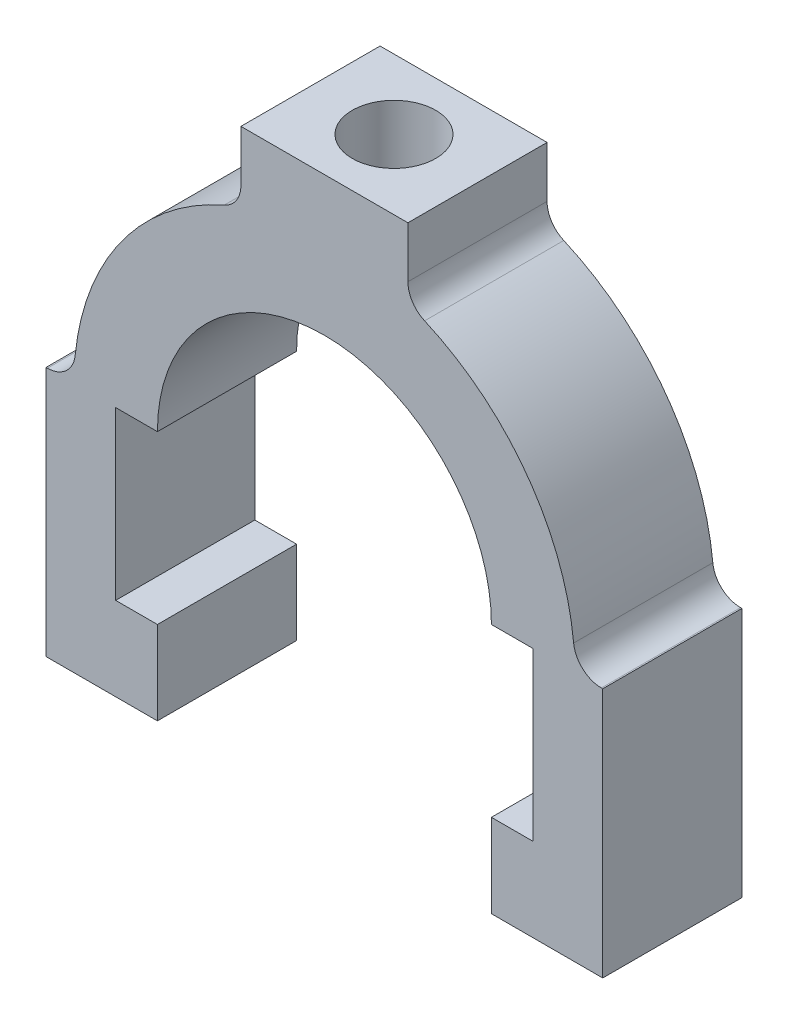
ISO-10303-21;
HEADER;
FILE_DESCRIPTION(('STEP AP214'),'2;1');
FILE_NAME('part.step','',(''),(''),'','','');
FILE_SCHEMA(('AUTOMOTIVE_DESIGN { 1 0 10303 214 1 1 1 1 }'));
ENDSEC;
DATA;
#1=APPLICATION_CONTEXT('core data for automotive mechanical design processes');
#2=APPLICATION_PROTOCOL_DEFINITION('international standard','automotive_design',2000,#1);
#3=PRODUCT_CONTEXT('',#1,'mechanical');
#4=PRODUCT('Part','Part','',(#3));
#5=PRODUCT_RELATED_PRODUCT_CATEGORY('part','',(#4));
#6=PRODUCT_DEFINITION_FORMATION('','',#4);
#7=PRODUCT_DEFINITION_CONTEXT('part definition',#1,'design');
#8=PRODUCT_DEFINITION('design','',#6,#7);
#9=PRODUCT_DEFINITION_SHAPE('','',#8);
#10=(LENGTH_UNIT() NAMED_UNIT(*) SI_UNIT(.MILLI.,.METRE.));
#11=(NAMED_UNIT(*) PLANE_ANGLE_UNIT() SI_UNIT($,.RADIAN.));
#12=(NAMED_UNIT(*) SI_UNIT($,.STERADIAN.) SOLID_ANGLE_UNIT());
#13=UNCERTAINTY_MEASURE_WITH_UNIT(LENGTH_MEASURE(1.E-05),#10,'distance_accuracy_value','');
#14=(GEOMETRIC_REPRESENTATION_CONTEXT(3) GLOBAL_UNCERTAINTY_ASSIGNED_CONTEXT((#13)) GLOBAL_UNIT_ASSIGNED_CONTEXT((#10,
#11,#12)) REPRESENTATION_CONTEXT('',''));
#15=CARTESIAN_POINT('',(0.,0.,0.));
#16=DIRECTION('',(0.,0.,1.));
#17=DIRECTION('',(1.,0.,0.));
#18=AXIS2_PLACEMENT_3D('',#15,#16,#17);
#19=CARTESIAN_POINT('',(-16.,36.6606055596467,20.));
#20=DIRECTION('',(0.,0.,-1.));
#21=DIRECTION('',(-1.,0.,0.));
#22=AXIS2_PLACEMENT_3D('',#19,#20,#21);
#23=CYLINDRICAL_SURFACE('',#22,4.);
#24=CARTESIAN_POINT('',(-16.,36.6606055596467,0.));
#25=DIRECTION('',(0.,0.,-1.));
#26=DIRECTION('',(1.,0.,0.));
#27=AXIS2_PLACEMENT_3D('',#24,#25,#26);
#28=CIRCLE('',#27,4.);
#29=CARTESIAN_POINT('',(-12.,36.6606055596467,0.));
#30=VERTEX_POINT('',#29);
#31=CARTESIAN_POINT('',(-14.4,32.994545003682,0.));
#32=VERTEX_POINT('',#31);
#33=EDGE_CURVE('E258',#30,#32,#28,.T.);
#34=ORIENTED_EDGE('',*,*,#33,.T.);
#35=DIRECTION('',(0.,0.,-1.));
#36=VECTOR('',#35,1.);
#37=CARTESIAN_POINT('',(-14.4,32.994545003682,20.));
#38=LINE('',#37,#36);
#39=CARTESIAN_POINT('',(-14.4,32.994545003682,20.));
#40=VERTEX_POINT('',#39);
#41=EDGE_CURVE('E13',#40,#32,#38,.T.);
#42=ORIENTED_EDGE('',*,*,#41,.F.);
#43=CARTESIAN_POINT('',(-16.,36.6606055596467,20.));
#44=DIRECTION('',(0.,0.,-1.));
#45=DIRECTION('',(1.,0.,0.));
#46=AXIS2_PLACEMENT_3D('',#43,#44,#45);
#47=CIRCLE('',#46,4.);
#48=CARTESIAN_POINT('',(-12.,36.6606055596467,20.));
#49=VERTEX_POINT('',#48);
#50=EDGE_CURVE('E329',#49,#40,#47,.T.);
#51=ORIENTED_EDGE('',*,*,#50,.F.);
#52=DIRECTION('',(0.,0.,-1.));
#53=VECTOR('',#52,1.);
#54=CARTESIAN_POINT('',(-12.,36.6606055596467,20.));
#55=LINE('',#54,#53);
#56=EDGE_CURVE('E254',#49,#30,#55,.T.);
#57=ORIENTED_EDGE('',*,*,#56,.T.);
#58=EDGE_LOOP('',(#34,#42,#51,#57));
#59=FACE_BOUND('',#58,.T.);
#60=ADVANCED_FACE('F59',(#59),#23,.F.);
#61=CARTESIAN_POINT('',(0.,0.,20.));
#62=DIRECTION('',(0.,0.,-1.));
#63=DIRECTION('',(-1.,0.,0.));
#64=AXIS2_PLACEMENT_3D('',#61,#62,#63);
#65=CYLINDRICAL_SURFACE('',#64,36.);
#66=CARTESIAN_POINT('',(0.,0.,0.));
#67=DIRECTION('',(0.,0.,1.));
#68=DIRECTION('',(1.,0.,0.));
#69=AXIS2_PLACEMENT_3D('',#66,#67,#68);
#70=CIRCLE('',#69,36.);
#71=CARTESIAN_POINT('',(-35.8195477358383,3.59999999999999,0.));
#72=VERTEX_POINT('',#71);
#73=EDGE_CURVE('E262',#32,#72,#70,.T.);
#74=ORIENTED_EDGE('',*,*,#73,.T.);
#75=DIRECTION('',(0.,0.,-1.));
#76=VECTOR('',#75,1.);
#77=CARTESIAN_POINT('',(-35.8195477358383,3.59999999999999,20.));
#78=LINE('',#77,#76);
#79=CARTESIAN_POINT('',(-35.8195477358383,3.59999999999999,20.));
#80=VERTEX_POINT('',#79);
#81=EDGE_CURVE('E68',#80,#72,#78,.T.);
#82=ORIENTED_EDGE('',*,*,#81,.F.);
#83=CARTESIAN_POINT('',(0.,0.,20.));
#84=DIRECTION('',(0.,0.,1.));
#85=DIRECTION('',(1.,0.,0.));
#86=AXIS2_PLACEMENT_3D('',#83,#84,#85);
#87=CIRCLE('',#86,36.);
#88=EDGE_CURVE('E167',#40,#80,#87,.T.);
#89=ORIENTED_EDGE('',*,*,#88,.F.);
#90=ORIENTED_EDGE('',*,*,#41,.T.);
#91=EDGE_LOOP('',(#74,#82,#89,#90));
#92=FACE_BOUND('',#91,.T.);
#93=ADVANCED_FACE('F665',(#92),#65,.T.);
#94=CARTESIAN_POINT('',(-39.7994974842648,3.99999999999999,20.));
#95=DIRECTION('',(0.,0.,-1.));
#96=DIRECTION('',(-1.,0.,0.));
#97=AXIS2_PLACEMENT_3D('',#94,#95,#96);
#98=CYLINDRICAL_SURFACE('',#97,4.);
#99=CARTESIAN_POINT('',(-39.7994974842648,3.99999999999999,0.));
#100=DIRECTION('',(0.,0.,-1.));
#101=DIRECTION('',(1.,0.,0.));
#102=AXIS2_PLACEMENT_3D('',#99,#100,#101);
#103=CIRCLE('',#102,4.);
#104=CARTESIAN_POINT('',(-39.7994974842648,0.,0.));
#105=VERTEX_POINT('',#104);
#106=EDGE_CURVE('E266',#72,#105,#103,.T.);
#107=ORIENTED_EDGE('',*,*,#106,.T.);
#108=DIRECTION('',(0.,0.,-1.));
#109=VECTOR('',#108,1.);
#110=CARTESIAN_POINT('',(-39.7994974842648,0.,20.));
#111=LINE('',#110,#109);
#112=CARTESIAN_POINT('',(-39.7994974842648,0.,20.));
#113=VERTEX_POINT('',#112);
#114=EDGE_CURVE('E404',#113,#105,#111,.T.);
#115=ORIENTED_EDGE('',*,*,#114,.F.);
#116=CARTESIAN_POINT('',(-39.7994974842648,3.99999999999999,20.));
#117=DIRECTION('',(0.,0.,-1.));
#118=DIRECTION('',(1.,0.,0.));
#119=AXIS2_PLACEMENT_3D('',#116,#117,#118);
#120=CIRCLE('',#119,4.);
#121=EDGE_CURVE('E416',#80,#113,#120,.T.);
#122=ORIENTED_EDGE('',*,*,#121,.F.);
#123=ORIENTED_EDGE('',*,*,#81,.T.);
#124=EDGE_LOOP('',(#107,#115,#122,#123));
#125=FACE_BOUND('',#124,.T.);
#126=ADVANCED_FACE('F414',(#125),#98,.F.);
#127=CARTESIAN_POINT('',(-40.,0.,20.));
#128=DIRECTION('',(0.,-1.,0.));
#129=DIRECTION('',(1.,0.,0.));
#130=AXIS2_PLACEMENT_3D('',#127,#128,#129);
#131=PLANE('',#130);
#132=DIRECTION('',(-1.,0.,0.));
#133=VECTOR('',#132,1.);
#134=CARTESIAN_POINT('',(-40.,0.,0.));
#135=LINE('',#134,#133);
#136=CARTESIAN_POINT('',(-40.,0.,0.));
#137=VERTEX_POINT('',#136);
#138=EDGE_CURVE('E269',#105,#137,#135,.T.);
#139=ORIENTED_EDGE('',*,*,#138,.T.);
#140=DIRECTION('',(0.,0.,-1.));
#141=VECTOR('',#140,1.);
#142=CARTESIAN_POINT('',(-40.,0.,20.));
#143=LINE('',#142,#141);
#144=CARTESIAN_POINT('',(-40.,0.,20.));
#145=VERTEX_POINT('',#144);
#146=EDGE_CURVE('E400',#145,#137,#143,.T.);
#147=ORIENTED_EDGE('',*,*,#146,.F.);
#148=DIRECTION('',(-1.,0.,0.));
#149=VECTOR('',#148,1.);
#150=CARTESIAN_POINT('',(-40.,0.,20.));
#151=LINE('',#150,#149);
#152=EDGE_CURVE('E435',#113,#145,#151,.T.);
#153=ORIENTED_EDGE('',*,*,#152,.F.);
#154=ORIENTED_EDGE('',*,*,#114,.T.);
#155=EDGE_LOOP('',(#139,#147,#153,#154));
#156=FACE_BOUND('',#155,.T.);
#157=ADVANCED_FACE('F425',(#156),#131,.F.);
#158=CARTESIAN_POINT('',(-40.,-36.,20.));
#159=DIRECTION('',(1.,0.,0.));
#160=DIRECTION('',(0.,1.,0.));
#161=AXIS2_PLACEMENT_3D('',#158,#159,#160);
#162=PLANE('',#161);
#163=DIRECTION('',(0.,-1.,0.));
#164=VECTOR('',#163,1.);
#165=CARTESIAN_POINT('',(-40.,-36.,0.));
#166=LINE('',#165,#164);
#167=CARTESIAN_POINT('',(-40.,-36.,0.));
#168=VERTEX_POINT('',#167);
#169=EDGE_CURVE('E272',#137,#168,#166,.T.);
#170=ORIENTED_EDGE('',*,*,#169,.T.);
#171=DIRECTION('',(0.,0.,-1.));
#172=VECTOR('',#171,1.);
#173=CARTESIAN_POINT('',(-40.,-36.,20.));
#174=LINE('',#173,#172);
#175=CARTESIAN_POINT('',(-40.,-36.,20.));
#176=VERTEX_POINT('',#175);
#177=EDGE_CURVE('E396',#176,#168,#174,.T.);
#178=ORIENTED_EDGE('',*,*,#177,.F.);
#179=DIRECTION('',(0.,-1.,0.));
#180=VECTOR('',#179,1.);
#181=CARTESIAN_POINT('',(-40.,-36.,20.));
#182=LINE('',#181,#180);
#183=EDGE_CURVE('E431',#145,#176,#182,.T.);
#184=ORIENTED_EDGE('',*,*,#183,.F.);
#185=ORIENTED_EDGE('',*,*,#146,.T.);
#186=EDGE_LOOP('',(#170,#178,#184,#185));
#187=FACE_BOUND('',#186,.T.);
#188=ADVANCED_FACE('F429',(#187),#162,.F.);
#189=CARTESIAN_POINT('',(-24.,-36.,20.));
#190=DIRECTION('',(0.,1.,0.));
#191=DIRECTION('',(-1.,0.,0.));
#192=AXIS2_PLACEMENT_3D('',#189,#190,#191);
#193=PLANE('',#192);
#194=DIRECTION('',(1.,0.,0.));
#195=VECTOR('',#194,1.);
#196=CARTESIAN_POINT('',(-24.,-36.,0.));
#197=LINE('',#196,#195);
#198=CARTESIAN_POINT('',(-24.,-36.,0.));
#199=VERTEX_POINT('',#198);
#200=EDGE_CURVE('E275',#168,#199,#197,.T.);
#201=ORIENTED_EDGE('',*,*,#200,.T.);
#202=DIRECTION('',(0.,0.,-1.));
#203=VECTOR('',#202,1.);
#204=CARTESIAN_POINT('',(-24.,-36.,20.));
#205=LINE('',#204,#203);
#206=CARTESIAN_POINT('',(-24.,-36.,20.));
#207=VERTEX_POINT('',#206);
#208=EDGE_CURVE('E392',#207,#199,#205,.T.);
#209=ORIENTED_EDGE('',*,*,#208,.F.);
#210=DIRECTION('',(1.,0.,0.));
#211=VECTOR('',#210,1.);
#212=CARTESIAN_POINT('',(-24.,-36.,20.));
#213=LINE('',#212,#211);
#214=EDGE_CURVE('E434',#176,#207,#213,.T.);
#215=ORIENTED_EDGE('',*,*,#214,.F.);
#216=ORIENTED_EDGE('',*,*,#177,.T.);
#217=EDGE_LOOP('',(#201,#209,#215,#216));
#218=FACE_BOUND('',#217,.T.);
#219=ADVANCED_FACE('F725',(#218),#193,.F.);
#220=CARTESIAN_POINT('',(-24.,-24.,20.));
#221=DIRECTION('',(-1.,0.,0.));
#222=DIRECTION('',(0.,0.,1.));
#223=AXIS2_PLACEMENT_3D('',#220,#221,#222);
#224=PLANE('',#223);
#225=DIRECTION('',(0.,1.,0.));
#226=VECTOR('',#225,1.);
#227=CARTESIAN_POINT('',(-24.,-24.,0.));
#228=LINE('',#227,#226);
#229=CARTESIAN_POINT('',(-24.,-24.,0.));
#230=VERTEX_POINT('',#229);
#231=EDGE_CURVE('E278',#199,#230,#228,.T.);
#232=ORIENTED_EDGE('',*,*,#231,.T.);
#233=DIRECTION('',(0.,0.,-1.));
#234=VECTOR('',#233,1.);
#235=CARTESIAN_POINT('',(-24.,-24.,20.));
#236=LINE('',#235,#234);
#237=CARTESIAN_POINT('',(-24.,-24.,20.));
#238=VERTEX_POINT('',#237);
#239=EDGE_CURVE('E388',#238,#230,#236,.T.);
#240=ORIENTED_EDGE('',*,*,#239,.F.);
#241=DIRECTION('',(0.,1.,0.));
#242=VECTOR('',#241,1.);
#243=CARTESIAN_POINT('',(-24.,-24.,20.));
#244=LINE('',#243,#242);
#245=EDGE_CURVE('E441',#207,#238,#244,.T.);
#246=ORIENTED_EDGE('',*,*,#245,.F.);
#247=ORIENTED_EDGE('',*,*,#208,.T.);
#248=EDGE_LOOP('',(#232,#240,#246,#247));
#249=FACE_BOUND('',#248,.T.);
#250=ADVANCED_FACE('F722',(#249),#224,.F.);
#251=CARTESIAN_POINT('',(-30.,-24.,20.));
#252=DIRECTION('',(0.,-1.,0.));
#253=DIRECTION('',(1.,0.,0.));
#254=AXIS2_PLACEMENT_3D('',#251,#252,#253);
#255=PLANE('',#254);
#256=DIRECTION('',(-1.,0.,0.));
#257=VECTOR('',#256,1.);
#258=CARTESIAN_POINT('',(-30.,-24.,0.));
#259=LINE('',#258,#257);
#260=CARTESIAN_POINT('',(-30.,-24.,0.));
#261=VERTEX_POINT('',#260);
#262=EDGE_CURVE('E281',#230,#261,#259,.T.);
#263=ORIENTED_EDGE('',*,*,#262,.T.);
#264=DIRECTION('',(0.,0.,-1.));
#265=VECTOR('',#264,1.);
#266=CARTESIAN_POINT('',(-30.,-24.,20.));
#267=LINE('',#266,#265);
#268=CARTESIAN_POINT('',(-30.,-24.,20.));
#269=VERTEX_POINT('',#268);
#270=EDGE_CURVE('E384',#269,#261,#267,.T.);
#271=ORIENTED_EDGE('',*,*,#270,.F.);
#272=DIRECTION('',(-1.,0.,0.));
#273=VECTOR('',#272,1.);
#274=CARTESIAN_POINT('',(-30.,-24.,20.));
#275=LINE('',#274,#273);
#276=EDGE_CURVE('E448',#238,#269,#275,.T.);
#277=ORIENTED_EDGE('',*,*,#276,.F.);
#278=ORIENTED_EDGE('',*,*,#239,.T.);
#279=EDGE_LOOP('',(#263,#271,#277,#278));
#280=FACE_BOUND('',#279,.T.);
#281=ADVANCED_FACE('F718',(#280),#255,.F.);
#282=CARTESIAN_POINT('',(-30.,0.,20.));
#283=DIRECTION('',(-1.,0.,0.));
#284=DIRECTION('',(0.,-1.,0.));
#285=AXIS2_PLACEMENT_3D('',#282,#283,#284);
#286=PLANE('',#285);
#287=DIRECTION('',(0.,1.,0.));
#288=VECTOR('',#287,1.);
#289=CARTESIAN_POINT('',(-30.,0.,0.));
#290=LINE('',#289,#288);
#291=CARTESIAN_POINT('',(-30.,0.,0.));
#292=VERTEX_POINT('',#291);
#293=EDGE_CURVE('E284',#261,#292,#290,.T.);
#294=ORIENTED_EDGE('',*,*,#293,.T.);
#295=DIRECTION('',(0.,0.,-1.));
#296=VECTOR('',#295,1.);
#297=CARTESIAN_POINT('',(-30.,0.,20.));
#298=LINE('',#297,#296);
#299=CARTESIAN_POINT('',(-30.,0.,20.));
#300=VERTEX_POINT('',#299);
#301=EDGE_CURVE('E380',#300,#292,#298,.T.);
#302=ORIENTED_EDGE('',*,*,#301,.F.);
#303=DIRECTION('',(0.,1.,0.));
#304=VECTOR('',#303,1.);
#305=CARTESIAN_POINT('',(-30.,0.,20.));
#306=LINE('',#305,#304);
#307=EDGE_CURVE('E451',#269,#300,#306,.T.);
#308=ORIENTED_EDGE('',*,*,#307,.F.);
#309=ORIENTED_EDGE('',*,*,#270,.T.);
#310=EDGE_LOOP('',(#294,#302,#308,#309));
#311=FACE_BOUND('',#310,.T.);
#312=ADVANCED_FACE('F713',(#311),#286,.F.);
#313=CARTESIAN_POINT('',(-24.,0.,20.));
#314=DIRECTION('',(0.,1.,0.));
#315=DIRECTION('',(-1.,0.,0.));
#316=AXIS2_PLACEMENT_3D('',#313,#314,#315);
#317=PLANE('',#316);
#318=DIRECTION('',(1.,0.,0.));
#319=VECTOR('',#318,1.);
#320=CARTESIAN_POINT('',(-24.,0.,0.));
#321=LINE('',#320,#319);
#322=CARTESIAN_POINT('',(-24.,0.,0.));
#323=VERTEX_POINT('',#322);
#324=EDGE_CURVE('E287',#292,#323,#321,.T.);
#325=ORIENTED_EDGE('',*,*,#324,.T.);
#326=DIRECTION('',(0.,0.,-1.));
#327=VECTOR('',#326,1.);
#328=CARTESIAN_POINT('',(-24.,0.,20.));
#329=LINE('',#328,#327);
#330=CARTESIAN_POINT('',(-24.,0.,20.));
#331=VERTEX_POINT('',#330);
#332=EDGE_CURVE('E376',#331,#323,#329,.T.);
#333=ORIENTED_EDGE('',*,*,#332,.F.);
#334=DIRECTION('',(1.,0.,0.));
#335=VECTOR('',#334,1.);
#336=CARTESIAN_POINT('',(-24.,0.,20.));
#337=LINE('',#336,#335);
#338=EDGE_CURVE('E454',#300,#331,#337,.T.);
#339=ORIENTED_EDGE('',*,*,#338,.F.);
#340=ORIENTED_EDGE('',*,*,#301,.T.);
#341=EDGE_LOOP('',(#325,#333,#339,#340));
#342=FACE_BOUND('',#341,.T.);
#343=ADVANCED_FACE('F662',(#342),#317,.F.);
#344=CARTESIAN_POINT('',(0.,0.,20.));
#345=DIRECTION('',(0.,0.,-1.));
#346=DIRECTION('',(-1.,0.,0.));
#347=AXIS2_PLACEMENT_3D('',#344,#345,#346);
#348=CYLINDRICAL_SURFACE('',#347,24.);
#349=CARTESIAN_POINT('',(0.,24.,16.));
#350=CARTESIAN_POINT('',(0.165805387403802,24.0000029962767,16.0000049489736));
#351=CARTESIAN_POINT('',(0.331556618095783,23.9982792337243,15.9931261251076));
#352=CARTESIAN_POINT('',(0.661898341499741,23.9914389070726,15.9656801379836));
#353=CARTESIAN_POINT('',(0.826488699612241,23.9863219558732,15.9451114129598));
#354=CARTESIAN_POINT('',(1.15331468289425,23.9728312747808,15.8904442806045));
#355=CARTESIAN_POINT('',(1.31554956136034,23.964456534561,15.8563416759915));
#356=CARTESIAN_POINT('',(1.63652999353389,23.9446785682943,15.7748760721035));
#357=CARTESIAN_POINT('',(1.7952742379173,23.9332742261501,15.7275081855849));
#358=CARTESIAN_POINT('',(2.10785890827135,23.9077704080524,15.6199828017296));
#359=CARTESIAN_POINT('',(2.26170674963502,23.8936752583917,15.5598458174177));
#360=CARTESIAN_POINT('',(2.56378623821258,23.8631527081916,15.4271745897842));
#361=CARTESIAN_POINT('',(2.71201578712804,23.8467244469549,15.3546357693375));
#362=CARTESIAN_POINT('',(3.00177661033544,23.8119848981805,15.1977372548709));
#363=CARTESIAN_POINT('',(3.1433102969363,23.7936742964517,15.1133818620482));
#364=CARTESIAN_POINT('',(3.41888526654491,23.7556431475739,14.9333882354096));
#365=CARTESIAN_POINT('',(3.5529237053449,23.7359220715781,14.8377457607558));
#366=CARTESIAN_POINT('',(3.81496434602383,23.6952304700178,14.6340140827509));
#367=CARTESIAN_POINT('',(3.94281308913214,23.674243775966,14.5257306874444));
#368=CARTESIAN_POINT('',(4.18902736841679,23.6319204183454,14.298846966889));
#369=CARTESIAN_POINT('',(4.30738936846955,23.6105836278175,14.1802428286891));
#370=CARTESIAN_POINT('',(4.53377489524013,23.5681596204781,13.9335611167013));
#371=CARTESIAN_POINT('',(4.64180103185486,23.5470723418473,13.8054859489905));
#372=CARTESIAN_POINT('',(4.84686316299839,23.5057198367545,13.5406185834632));
#373=CARTESIAN_POINT('',(4.94389508557169,23.4854549166434,13.403823185034));
#374=CARTESIAN_POINT('',(5.12757579334233,23.4460427828086,13.1203993860544));
#375=CARTESIAN_POINT('',(5.21405329073272,23.4269160793509,12.9736570210366));
#376=CARTESIAN_POINT('',(5.37434099239073,23.3906650895731,12.6731036888584));
#377=CARTESIAN_POINT('',(5.4481464054103,23.3735415614194,12.5192900758401));
#378=CARTESIAN_POINT('',(5.5824381696205,23.3418328254504,12.205771190017));
#379=CARTESIAN_POINT('',(5.6429311270007,23.3272463593972,12.046068885572));
#380=CARTESIAN_POINT('',(5.75016256060697,23.301043510543,11.7218770109329));
#381=CARTESIAN_POINT('',(5.79689611131117,23.2894281915328,11.5573857495113));
#382=CARTESIAN_POINT('',(5.91415157316671,23.2600431044562,11.0651783074134));
#383=CARTESIAN_POINT('',(5.96458986092324,23.2470332112981,10.7320163829238));
#384=CARTESIAN_POINT('',(5.99795848349603,23.23842608856,10.2298515486397));
#385=CARTESIAN_POINT('',(6.00202663613951,23.2373766993858,10.0619945228305));
#386=CARTESIAN_POINT('',(5.99610970800768,23.2389046091482,9.72652435084421));
#387=CARTESIAN_POINT('',(5.98612448822742,23.2414819439575,9.55891120709583));
#388=CARTESIAN_POINT('',(5.93594713474591,23.2543754061852,9.06652423822909));
#389=CARTESIAN_POINT('',(5.87607363848321,23.2697164452628,8.74366776503005));
#390=CARTESIAN_POINT('',(5.70489646981085,23.3122664593645,8.1129055417415));
#391=CARTESIAN_POINT('',(5.59358913348967,23.3394762798586,7.80500085847619));
#392=CARTESIAN_POINT('',(5.32155798729425,23.4030050803748,7.20906160097685));
#393=CARTESIAN_POINT('',(5.16034668919655,23.4394132393811,6.92125897835464));
#394=CARTESIAN_POINT('',(4.79342508379137,23.5171882932266,6.37632149481797));
#395=CARTESIAN_POINT('',(4.58770698972655,23.5585560552156,6.11919201259972));
#396=CARTESIAN_POINT('',(4.13065370439076,23.6430352608536,5.63518656072917));
#397=CARTESIAN_POINT('',(3.8781850342093,23.6861627896442,5.40938231393944));
#398=CARTESIAN_POINT('',(3.33844766846889,23.7682386126258,5.00311475595117));
#399=CARTESIAN_POINT('',(3.05117791031428,23.8071867791381,4.82265282972543));
#400=CARTESIAN_POINT('',(2.44846355524484,23.8767092866156,4.51179772857426));
#401=CARTESIAN_POINT('',(2.1329255733586,23.9072544059235,4.38157865729419));
#402=CARTESIAN_POINT('',(1.48350403204752,23.9563166788424,4.17633075885331));
#403=CARTESIAN_POINT('',(1.14962399502517,23.9748361331613,4.10129137454455));
#404=CARTESIAN_POINT('',(0.482159883096528,23.9974199712544,4.0101697375531));
#405=CARTESIAN_POINT('',(0.14878688552235,24.0018421411353,3.99262787748009));
#406=CARTESIAN_POINT('',(-0.51613150477504,23.996752191774,4.012996026439));
#407=CARTESIAN_POINT('',(-0.847677059317268,23.987241326857,4.05090104384998));
#408=CARTESIAN_POINT('',(-1.4944570546744,23.9555832478694,4.17988356198871));
#409=CARTESIAN_POINT('',(-1.80986040015949,23.9336253776701,4.27016478740322));
#410=CARTESIAN_POINT('',(-2.42102924553322,23.8795482551267,4.50042860264544));
#411=CARTESIAN_POINT('',(-2.71679275860286,23.8474279766146,4.64041621184185));
#412=CARTESIAN_POINT('',(-3.28609225023473,23.775732355911,4.96894350326124));
#413=CARTESIAN_POINT('',(-3.55914068563651,23.7360348408855,5.15830064078757));
#414=CARTESIAN_POINT('',(-4.07010753646663,23.6537802212633,5.57916344464519));
#415=CARTESIAN_POINT('',(-4.30801987625634,23.6112226239559,5.81067638502544));
#416=CARTESIAN_POINT('',(-4.74795813275243,23.526758837948,6.31599326761707));
#417=CARTESIAN_POINT('',(-4.94895984477464,23.4848942795269,6.59069579218291));
#418=CARTESIAN_POINT('',(-5.30205866107055,23.4077130231476,7.17098555524694));
#419=CARTESIAN_POINT('',(-5.45415793615243,23.3723960345683,7.47657142202354));
#420=CARTESIAN_POINT('',(-5.64160870712871,23.3275859445682,7.95036011901535));
#421=CARTESIAN_POINT('',(-5.69722158138528,23.3140336618751,8.11044327829627));
#422=CARTESIAN_POINT('',(-5.79475769208555,23.2899834650234,8.43493482969514));
#423=CARTESIAN_POINT('',(-5.83668611505733,23.2794843938355,8.59934155755361));
#424=CARTESIAN_POINT('',(-5.9064899745362,23.2618715740422,8.93128294865933));
#425=CARTESIAN_POINT('',(-5.93436517338602,23.2547578826878,9.09881766475502));
#426=CARTESIAN_POINT('',(-5.97582085063046,23.2441396190328,9.43575786636507));
#427=CARTESIAN_POINT('',(-5.98940200008078,23.2406348773048,9.60516326368014));
#428=CARTESIAN_POINT('',(-6.00196347285349,23.2373938489065,9.93966894494398));
#429=CARTESIAN_POINT('',(-6.0013522054121,23.2375521518778,10.1047530313471));
#430=CARTESIAN_POINT('',(-5.98653576306369,23.2413736324535,10.4342665001568));
#431=CARTESIAN_POINT('',(-5.97233089751311,23.2450367302975,10.598695897377));
#432=CARTESIAN_POINT('',(-5.93044575509701,23.2557579721328,10.9257410344122));
#433=CARTESIAN_POINT('',(-5.90276341290372,23.2628166364686,11.0883564923458));
#434=CARTESIAN_POINT('',(-5.83416667908453,23.2801148571724,11.4105376668584));
#435=CARTESIAN_POINT('',(-5.79325695086328,23.2903532924405,11.5701044373057));
#436=CARTESIAN_POINT('',(-5.69880203716712,23.313644179093,11.8842523863261));
#437=CARTESIAN_POINT('',(-5.64532943643257,23.3266804293978,12.0388566126103));
#438=CARTESIAN_POINT('',(-5.52605852883571,23.3552228194459,12.3429342235871));
#439=CARTESIAN_POINT('',(-5.46026449802037,23.3707281020539,12.4924093670543));
#440=CARTESIAN_POINT('',(-5.31678835542035,23.4037855982137,12.7853867449869));
#441=CARTESIAN_POINT('',(-5.23910089912543,23.4213387311534,12.9288862571421));
#442=CARTESIAN_POINT('',(-5.07243073970643,23.4579990976357,13.208891456609));
#443=CARTESIAN_POINT('',(-4.98345174049215,23.4771058208267,13.3453994168081));
#444=CARTESIAN_POINT('',(-4.79227290328379,23.5168854335111,13.6141426790837));
#445=CARTESIAN_POINT('',(-4.68978556121475,23.5375863850894,13.7461693832206));
#446=CARTESIAN_POINT('',(-4.4742434518464,23.579507882839,14.001125128433));
#447=CARTESIAN_POINT('',(-4.36119228671727,23.6007282500856,14.1240572452482));
#448=CARTESIAN_POINT('',(-4.12516419546941,23.6431258862839,14.3601488853344));
#449=CARTESIAN_POINT('',(-4.0021814457299,23.6643031223737,14.4733025931207));
#450=CARTESIAN_POINT('',(-3.7471917650141,23.7060168559165,14.6889686779036));
#451=CARTESIAN_POINT('',(-3.61518813420472,23.7265535837286,14.7914849122748));
#452=CARTESIAN_POINT('',(-3.34044186706075,23.7668061369628,14.9870231939444));
#453=CARTESIAN_POINT('',(-3.19754553860501,23.7864996932668,15.0798340610588));
#454=CARTESIAN_POINT('',(-2.90425652857032,23.824087485808,15.253026701334));
#455=CARTESIAN_POINT('',(-2.75386663022821,23.8419823827553,15.3334130443325));
#456=CARTESIAN_POINT('',(-2.44663692885417,23.8754647710401,15.4811494871589));
#457=CARTESIAN_POINT('',(-2.2897999415517,23.8910532562916,15.5485052062122));
#458=CARTESIAN_POINT('',(-1.97079001830643,23.9194829588902,15.6696663554929));
#459=CARTESIAN_POINT('',(-1.80861789148403,23.9323245906257,15.723473829816));
#460=CARTESIAN_POINT('',(-1.3777763047293,23.9619049568243,15.8462328539043));
#461=CARTESIAN_POINT('',(-1.10559147265769,23.9761014751911,15.9037953778407));
#462=CARTESIAN_POINT('',(-0.55555350244454,23.9951461360496,15.980673368139));
#463=CARTESIAN_POINT('',(-0.277700792219541,23.9999949816564,15.9999917111627));
#464=CARTESIAN_POINT('',(0.,24.,16.));
#465=B_SPLINE_CURVE_WITH_KNOTS('',3,(#349,#350,#351,#352,#353,#354,#355,#356,#357,#358,#359,
#360,#361,#362,#363,#364,#365,#366,#367,#368,#369,#370,#371,#372,#373,#374,#375,#376,#377,#378,
#379,#380,#381,#382,#383,#384,#385,#386,#387,#388,#389,#390,#391,#392,#393,#394,#395,#396,#397,
#398,#399,#400,#401,#402,#403,#404,#405,#406,#407,#408,#409,#410,#411,#412,#413,#414,#415,#416,
#417,#418,#419,#420,#421,#422,#423,#424,#425,#426,#427,#428,#429,#430,#431,#432,#433,#434,#435,
#436,#437,#438,#439,#440,#441,#442,#443,#444,#445,#446,#447,#448,#449,#450,#451,#452,#453,#454,
#455,#456,#457,#458,#459,#460,#461,#462,#463,#464),.UNSPECIFIED.,.T.,.F.,(4,2,2,2,2,2,2,2,2,2,2,
2,2,2,2,2,2,2,2,2,2,2,2,2,2,2,2,2,2,2,2,2,2,2,2,2,2,2,2,2,2,2,2,2,2,2,2,2,2,2,2,2,2,2,2,2,2,4),
(0.,0.497171453608337,0.994399635056342,1.49178214324908,1.98934814054333,2.48612078574438,
2.98307717135303,3.47985313409878,3.97681634579052,4.48278784834555,4.98894707988207,
5.49497816255321,6.00119605682159,6.51476681838441,7.02853133276356,7.54204031819885,
8.0557329040678,9.06140626133586,9.56463055957973,10.0678598353591,11.0489981911534,
12.0302064495334,13.021319425847,14.0126059443384,15.0321583496526,16.0517418932217,
17.0748274712564,18.0977172584376,19.0944306688629,20.0910543554016,21.0729092914533,
22.0548634037835,23.0542418135059,24.0537928312126,25.0778786790709,26.1019190608722,
26.6114255778037,27.1207387624019,27.6300605598219,28.1393584452954,28.6340191333343,
29.1286685643954,29.6233938208458,30.1179448483897,30.6097058740945,31.10129655354,
31.593108789452,32.0847601135969,32.5894192432003,33.0939069121446,33.5986925778495,
34.1032945530713,34.6172488082312,35.1310135748031,35.6445562931573,36.1580214841036,
36.9907766489356,37.8234691729712),.UNSPECIFIED.);
#466=CARTESIAN_POINT('',(0.,24.,16.));
#467=VERTEX_POINT('',#466);
#468=EDGE_CURVE('E263',#467,#467,#465,.T.);
#469=ORIENTED_EDGE('',*,*,#468,.T.);
#470=EDGE_LOOP('',(#469));
#471=FACE_BOUND('',#470,.T.);
#472=CARTESIAN_POINT('',(0.,0.,0.));
#473=DIRECTION('',(0.,0.,-1.));
#474=DIRECTION('',(1.,0.,0.));
#475=AXIS2_PLACEMENT_3D('',#472,#473,#474);
#476=CIRCLE('',#475,24.);
#477=CARTESIAN_POINT('',(24.,0.,0.));
#478=VERTEX_POINT('',#477);
#479=EDGE_CURVE('E290',#323,#478,#476,.T.);
#480=ORIENTED_EDGE('',*,*,#479,.T.);
#481=DIRECTION('',(0.,0.,-1.));
#482=VECTOR('',#481,1.);
#483=CARTESIAN_POINT('',(24.,0.,20.));
#484=LINE('',#483,#482);
#485=CARTESIAN_POINT('',(24.,0.,20.));
#486=VERTEX_POINT('',#485);
#487=EDGE_CURVE('E372',#486,#478,#484,.T.);
#488=ORIENTED_EDGE('',*,*,#487,.F.);
#489=CARTESIAN_POINT('',(0.,0.,20.));
#490=DIRECTION('',(0.,0.,-1.));
#491=DIRECTION('',(1.,0.,0.));
#492=AXIS2_PLACEMENT_3D('',#489,#490,#491);
#493=CIRCLE('',#492,24.);
#494=EDGE_CURVE('E457',#331,#486,#493,.T.);
#495=ORIENTED_EDGE('',*,*,#494,.F.);
#496=ORIENTED_EDGE('',*,*,#332,.T.);
#497=EDGE_LOOP('',(#480,#488,#495,#496));
#498=FACE_BOUND('',#497,.T.);
#499=ADVANCED_FACE('F600',(#471,#498),#348,.F.);
#500=CARTESIAN_POINT('',(24.,0.,20.));
#501=DIRECTION('',(0.,1.,0.));
#502=DIRECTION('',(-1.,0.,0.));
#503=AXIS2_PLACEMENT_3D('',#500,#501,#502);
#504=PLANE('',#503);
#505=DIRECTION('',(1.,0.,0.));
#506=VECTOR('',#505,1.);
#507=CARTESIAN_POINT('',(24.,0.,0.));
#508=LINE('',#507,#506);
#509=CARTESIAN_POINT('',(30.,0.,0.));
#510=VERTEX_POINT('',#509);
#511=EDGE_CURVE('E293',#478,#510,#508,.T.);
#512=ORIENTED_EDGE('',*,*,#511,.T.);
#513=DIRECTION('',(0.,0.,-1.));
#514=VECTOR('',#513,1.);
#515=CARTESIAN_POINT('',(30.,0.,20.));
#516=LINE('',#515,#514);
#517=CARTESIAN_POINT('',(30.,0.,20.));
#518=VERTEX_POINT('',#517);
#519=EDGE_CURVE('E368',#518,#510,#516,.T.);
#520=ORIENTED_EDGE('',*,*,#519,.F.);
#521=DIRECTION('',(1.,0.,0.));
#522=VECTOR('',#521,1.);
#523=CARTESIAN_POINT('',(24.,0.,20.));
#524=LINE('',#523,#522);
#525=EDGE_CURVE('E460',#486,#518,#524,.T.);
#526=ORIENTED_EDGE('',*,*,#525,.F.);
#527=ORIENTED_EDGE('',*,*,#487,.T.);
#528=EDGE_LOOP('',(#512,#520,#526,#527));
#529=FACE_BOUND('',#528,.T.);
#530=ADVANCED_FACE('F654',(#529),#504,.F.);
#531=CARTESIAN_POINT('',(30.,0.,20.));
#532=DIRECTION('',(1.,0.,0.));
#533=DIRECTION('',(0.,1.,0.));
#534=AXIS2_PLACEMENT_3D('',#531,#532,#533);
#535=PLANE('',#534);
#536=DIRECTION('',(0.,-1.,0.));
#537=VECTOR('',#536,1.);
#538=CARTESIAN_POINT('',(30.,0.,0.));
#539=LINE('',#538,#537);
#540=CARTESIAN_POINT('',(30.,-24.,0.));
#541=VERTEX_POINT('',#540);
#542=EDGE_CURVE('E296',#510,#541,#539,.T.);
#543=ORIENTED_EDGE('',*,*,#542,.T.);
#544=DIRECTION('',(0.,0.,-1.));
#545=VECTOR('',#544,1.);
#546=CARTESIAN_POINT('',(30.,-24.,20.));
#547=LINE('',#546,#545);
#548=CARTESIAN_POINT('',(30.,-24.,20.));
#549=VERTEX_POINT('',#548);
#550=EDGE_CURVE('E364',#549,#541,#547,.T.);
#551=ORIENTED_EDGE('',*,*,#550,.F.);
#552=DIRECTION('',(0.,-1.,0.));
#553=VECTOR('',#552,1.);
#554=CARTESIAN_POINT('',(30.,0.,20.));
#555=LINE('',#554,#553);
#556=EDGE_CURVE('E463',#518,#549,#555,.T.);
#557=ORIENTED_EDGE('',*,*,#556,.F.);
#558=ORIENTED_EDGE('',*,*,#519,.T.);
#559=EDGE_LOOP('',(#543,#551,#557,#558));
#560=FACE_BOUND('',#559,.T.);
#561=ADVANCED_FACE('F651',(#560),#535,.F.);
#562=CARTESIAN_POINT('',(30.,-24.,20.));
#563=DIRECTION('',(0.,-1.,0.));
#564=DIRECTION('',(1.,0.,0.));
#565=AXIS2_PLACEMENT_3D('',#562,#563,#564);
#566=PLANE('',#565);
#567=DIRECTION('',(-1.,0.,0.));
#568=VECTOR('',#567,1.);
#569=CARTESIAN_POINT('',(30.,-24.,0.));
#570=LINE('',#569,#568);
#571=CARTESIAN_POINT('',(24.,-24.,0.));
#572=VERTEX_POINT('',#571);
#573=EDGE_CURVE('E299',#541,#572,#570,.T.);
#574=ORIENTED_EDGE('',*,*,#573,.T.);
#575=DIRECTION('',(0.,0.,-1.));
#576=VECTOR('',#575,1.);
#577=CARTESIAN_POINT('',(24.,-24.,20.));
#578=LINE('',#577,#576);
#579=CARTESIAN_POINT('',(24.,-24.,20.));
#580=VERTEX_POINT('',#579);
#581=EDGE_CURVE('E360',#580,#572,#578,.T.);
#582=ORIENTED_EDGE('',*,*,#581,.F.);
#583=DIRECTION('',(-1.,0.,0.));
#584=VECTOR('',#583,1.);
#585=CARTESIAN_POINT('',(30.,-24.,20.));
#586=LINE('',#585,#584);
#587=EDGE_CURVE('E466',#549,#580,#586,.T.);
#588=ORIENTED_EDGE('',*,*,#587,.F.);
#589=ORIENTED_EDGE('',*,*,#550,.T.);
#590=EDGE_LOOP('',(#574,#582,#588,#589));
#591=FACE_BOUND('',#590,.T.);
#592=ADVANCED_FACE('F647',(#591),#566,.F.);
#593=CARTESIAN_POINT('',(24.,-24.,20.));
#594=DIRECTION('',(1.,0.,0.));
#595=DIRECTION('',(0.,0.,-1.));
#596=AXIS2_PLACEMENT_3D('',#593,#594,#595);
#597=PLANE('',#596);
#598=DIRECTION('',(0.,-1.,0.));
#599=VECTOR('',#598,1.);
#600=CARTESIAN_POINT('',(24.,-24.,0.));
#601=LINE('',#600,#599);
#602=CARTESIAN_POINT('',(24.,-36.,0.));
#603=VERTEX_POINT('',#602);
#604=EDGE_CURVE('E302',#572,#603,#601,.T.);
#605=ORIENTED_EDGE('',*,*,#604,.T.);
#606=DIRECTION('',(0.,0.,-1.));
#607=VECTOR('',#606,1.);
#608=CARTESIAN_POINT('',(24.,-36.,20.));
#609=LINE('',#608,#607);
#610=CARTESIAN_POINT('',(24.,-36.,20.));
#611=VERTEX_POINT('',#610);
#612=EDGE_CURVE('E356',#611,#603,#609,.T.);
#613=ORIENTED_EDGE('',*,*,#612,.F.);
#614=DIRECTION('',(0.,-1.,0.));
#615=VECTOR('',#614,1.);
#616=CARTESIAN_POINT('',(24.,-24.,20.));
#617=LINE('',#616,#615);
#618=EDGE_CURVE('E469',#580,#611,#617,.T.);
#619=ORIENTED_EDGE('',*,*,#618,.F.);
#620=ORIENTED_EDGE('',*,*,#581,.T.);
#621=EDGE_LOOP('',(#605,#613,#619,#620));
#622=FACE_BOUND('',#621,.T.);
#623=ADVANCED_FACE('F643',(#622),#597,.F.);
#624=CARTESIAN_POINT('',(24.,-36.,20.));
#625=DIRECTION('',(0.,1.,0.));
#626=DIRECTION('',(-1.,0.,0.));
#627=AXIS2_PLACEMENT_3D('',#624,#625,#626);
#628=PLANE('',#627);
#629=DIRECTION('',(1.,0.,0.));
#630=VECTOR('',#629,1.);
#631=CARTESIAN_POINT('',(24.,-36.,0.));
#632=LINE('',#631,#630);
#633=CARTESIAN_POINT('',(40.,-36.,0.));
#634=VERTEX_POINT('',#633);
#635=EDGE_CURVE('E305',#603,#634,#632,.T.);
#636=ORIENTED_EDGE('',*,*,#635,.T.);
#637=DIRECTION('',(0.,0.,-1.));
#638=VECTOR('',#637,1.);
#639=CARTESIAN_POINT('',(40.,-36.,20.));
#640=LINE('',#639,#638);
#641=CARTESIAN_POINT('',(40.,-36.,20.));
#642=VERTEX_POINT('',#641);
#643=EDGE_CURVE('E352',#642,#634,#640,.T.);
#644=ORIENTED_EDGE('',*,*,#643,.F.);
#645=DIRECTION('',(1.,0.,0.));
#646=VECTOR('',#645,1.);
#647=CARTESIAN_POINT('',(24.,-36.,20.));
#648=LINE('',#647,#646);
#649=EDGE_CURVE('E472',#611,#642,#648,.T.);
#650=ORIENTED_EDGE('',*,*,#649,.F.);
#651=ORIENTED_EDGE('',*,*,#612,.T.);
#652=EDGE_LOOP('',(#636,#644,#650,#651));
#653=FACE_BOUND('',#652,.T.);
#654=ADVANCED_FACE('F639',(#653),#628,.F.);
#655=CARTESIAN_POINT('',(40.,-36.,20.));
#656=DIRECTION('',(-1.,0.,0.));
#657=DIRECTION('',(0.,-1.,0.));
#658=AXIS2_PLACEMENT_3D('',#655,#656,#657);
#659=PLANE('',#658);
#660=DIRECTION('',(0.,1.,0.));
#661=VECTOR('',#660,1.);
#662=CARTESIAN_POINT('',(40.,-36.,0.));
#663=LINE('',#662,#661);
#664=CARTESIAN_POINT('',(40.,0.,0.));
#665=VERTEX_POINT('',#664);
#666=EDGE_CURVE('E308',#634,#665,#663,.T.);
#667=ORIENTED_EDGE('',*,*,#666,.T.);
#668=DIRECTION('',(0.,0.,-1.));
#669=VECTOR('',#668,1.);
#670=CARTESIAN_POINT('',(40.,0.,20.));
#671=LINE('',#670,#669);
#672=CARTESIAN_POINT('',(40.,0.,20.));
#673=VERTEX_POINT('',#672);
#674=EDGE_CURVE('E348',#673,#665,#671,.T.);
#675=ORIENTED_EDGE('',*,*,#674,.F.);
#676=DIRECTION('',(0.,1.,0.));
#677=VECTOR('',#676,1.);
#678=CARTESIAN_POINT('',(40.,-36.,20.));
#679=LINE('',#678,#677);
#680=EDGE_CURVE('E475',#642,#673,#679,.T.);
#681=ORIENTED_EDGE('',*,*,#680,.F.);
#682=ORIENTED_EDGE('',*,*,#643,.T.);
#683=EDGE_LOOP('',(#667,#675,#681,#682));
#684=FACE_BOUND('',#683,.T.);
#685=ADVANCED_FACE('F635',(#684),#659,.F.);
#686=CARTESIAN_POINT('',(40.,0.,20.));
#687=DIRECTION('',(0.,-1.,0.));
#688=DIRECTION('',(1.,0.,0.));
#689=AXIS2_PLACEMENT_3D('',#686,#687,#688);
#690=PLANE('',#689);
#691=DIRECTION('',(-1.,0.,0.));
#692=VECTOR('',#691,1.);
#693=CARTESIAN_POINT('',(40.,0.,0.));
#694=LINE('',#693,#692);
#695=CARTESIAN_POINT('',(39.7994974842648,0.,0.));
#696=VERTEX_POINT('',#695);
#697=EDGE_CURVE('E311',#665,#696,#694,.T.);
#698=ORIENTED_EDGE('',*,*,#697,.T.);
#699=DIRECTION('',(0.,0.,-1.));
#700=VECTOR('',#699,1.);
#701=CARTESIAN_POINT('',(39.7994974842648,0.,20.));
#702=LINE('',#701,#700);
#703=CARTESIAN_POINT('',(39.7994974842648,0.,20.));
#704=VERTEX_POINT('',#703);
#705=EDGE_CURVE('E344',#704,#696,#702,.T.);
#706=ORIENTED_EDGE('',*,*,#705,.F.);
#707=DIRECTION('',(-1.,0.,0.));
#708=VECTOR('',#707,1.);
#709=CARTESIAN_POINT('',(40.,0.,20.));
#710=LINE('',#709,#708);
#711=EDGE_CURVE('E478',#673,#704,#710,.T.);
#712=ORIENTED_EDGE('',*,*,#711,.F.);
#713=ORIENTED_EDGE('',*,*,#674,.T.);
#714=EDGE_LOOP('',(#698,#706,#712,#713));
#715=FACE_BOUND('',#714,.T.);
#716=ADVANCED_FACE('F631',(#715),#690,.F.);
#717=CARTESIAN_POINT('',(39.7994974842648,4.,20.));
#718=DIRECTION('',(0.,0.,-1.));
#719=DIRECTION('',(-1.,0.,0.));
#720=AXIS2_PLACEMENT_3D('',#717,#718,#719);
#721=CYLINDRICAL_SURFACE('',#720,4.);
#722=CARTESIAN_POINT('',(39.7994974842648,4.,0.));
#723=DIRECTION('',(0.,0.,-1.));
#724=DIRECTION('',(-1.,0.,0.));
#725=AXIS2_PLACEMENT_3D('',#722,#723,#724);
#726=CIRCLE('',#725,4.);
#727=CARTESIAN_POINT('',(35.8195477358383,3.6,0.));
#728=VERTEX_POINT('',#727);
#729=EDGE_CURVE('E314',#696,#728,#726,.T.);
#730=ORIENTED_EDGE('',*,*,#729,.T.);
#731=DIRECTION('',(0.,0.,-1.));
#732=VECTOR('',#731,1.);
#733=CARTESIAN_POINT('',(35.8195477358383,3.6,20.));
#734=LINE('',#733,#732);
#735=CARTESIAN_POINT('',(35.8195477358383,3.6,20.));
#736=VERTEX_POINT('',#735);
#737=EDGE_CURVE('E340',#736,#728,#734,.T.);
#738=ORIENTED_EDGE('',*,*,#737,.F.);
#739=CARTESIAN_POINT('',(39.7994974842648,4.,20.));
#740=DIRECTION('',(0.,0.,-1.));
#741=DIRECTION('',(-1.,0.,0.));
#742=AXIS2_PLACEMENT_3D('',#739,#740,#741);
#743=CIRCLE('',#742,4.);
#744=EDGE_CURVE('E481',#704,#736,#743,.T.);
#745=ORIENTED_EDGE('',*,*,#744,.F.);
#746=ORIENTED_EDGE('',*,*,#705,.T.);
#747=EDGE_LOOP('',(#730,#738,#745,#746));
#748=FACE_BOUND('',#747,.T.);
#749=ADVANCED_FACE('F627',(#748),#721,.F.);
#750=CARTESIAN_POINT('',(0.,0.,20.));
#751=DIRECTION('',(0.,0.,-1.));
#752=DIRECTION('',(-1.,0.,0.));
#753=AXIS2_PLACEMENT_3D('',#750,#751,#752);
#754=CYLINDRICAL_SURFACE('',#753,36.);
#755=CARTESIAN_POINT('',(0.,0.,0.));
#756=DIRECTION('',(0.,0.,1.));
#757=DIRECTION('',(1.,0.,0.));
#758=AXIS2_PLACEMENT_3D('',#755,#756,#757);
#759=CIRCLE('',#758,36.);
#760=CARTESIAN_POINT('',(14.4,32.994545003682,0.));
#761=VERTEX_POINT('',#760);
#762=EDGE_CURVE('E317',#728,#761,#759,.T.);
#763=ORIENTED_EDGE('',*,*,#762,.T.);
#764=DIRECTION('',(0.,0.,-1.));
#765=VECTOR('',#764,1.);
#766=CARTESIAN_POINT('',(14.4,32.994545003682,20.));
#767=LINE('',#766,#765);
#768=CARTESIAN_POINT('',(14.4,32.994545003682,20.));
#769=VERTEX_POINT('',#768);
#770=EDGE_CURVE('E336',#769,#761,#767,.T.);
#771=ORIENTED_EDGE('',*,*,#770,.F.);
#772=CARTESIAN_POINT('',(0.,0.,20.));
#773=DIRECTION('',(0.,0.,1.));
#774=DIRECTION('',(1.,0.,0.));
#775=AXIS2_PLACEMENT_3D('',#772,#773,#774);
#776=CIRCLE('',#775,36.);
#777=EDGE_CURVE('E484',#736,#769,#776,.T.);
#778=ORIENTED_EDGE('',*,*,#777,.F.);
#779=ORIENTED_EDGE('',*,*,#737,.T.);
#780=EDGE_LOOP('',(#763,#771,#778,#779));
#781=FACE_BOUND('',#780,.T.);
#782=ADVANCED_FACE('F623',(#781),#754,.T.);
#783=CARTESIAN_POINT('',(16.,36.6606055596467,20.));
#784=DIRECTION('',(0.,0.,-1.));
#785=DIRECTION('',(-1.,0.,0.));
#786=AXIS2_PLACEMENT_3D('',#783,#784,#785);
#787=CYLINDRICAL_SURFACE('',#786,4.);
#788=CARTESIAN_POINT('',(16.,36.6606055596467,0.));
#789=DIRECTION('',(0.,0.,-1.));
#790=DIRECTION('',(-1.,0.,0.));
#791=AXIS2_PLACEMENT_3D('',#788,#789,#790);
#792=CIRCLE('',#791,4.);
#793=CARTESIAN_POINT('',(12.,36.6606055596467,0.));
#794=VERTEX_POINT('',#793);
#795=EDGE_CURVE('E320',#761,#794,#792,.T.);
#796=ORIENTED_EDGE('',*,*,#795,.T.);
#797=DIRECTION('',(0.,0.,-1.));
#798=VECTOR('',#797,1.);
#799=CARTESIAN_POINT('',(12.,36.6606055596467,20.));
#800=LINE('',#799,#798);
#801=CARTESIAN_POINT('',(12.,36.6606055596467,20.));
#802=VERTEX_POINT('',#801);
#803=EDGE_CURVE('E245',#802,#794,#800,.T.);
#804=ORIENTED_EDGE('',*,*,#803,.F.);
#805=CARTESIAN_POINT('',(16.,36.6606055596467,20.));
#806=DIRECTION('',(0.,0.,-1.));
#807=DIRECTION('',(-1.,0.,0.));
#808=AXIS2_PLACEMENT_3D('',#805,#806,#807);
#809=CIRCLE('',#808,4.);
#810=EDGE_CURVE('E234',#769,#802,#809,.T.);
#811=ORIENTED_EDGE('',*,*,#810,.F.);
#812=ORIENTED_EDGE('',*,*,#770,.T.);
#813=EDGE_LOOP('',(#796,#804,#811,#812));
#814=FACE_BOUND('',#813,.T.);
#815=ADVANCED_FACE('F620',(#814),#787,.F.);
#816=CARTESIAN_POINT('',(12.,36.6606055596467,20.));
#817=DIRECTION('',(-1.,0.,0.));
#818=DIRECTION('',(0.,-1.,0.));
#819=AXIS2_PLACEMENT_3D('',#816,#817,#818);
#820=PLANE('',#819);
#821=DIRECTION('',(0.,1.,0.));
#822=VECTOR('',#821,1.);
#823=CARTESIAN_POINT('',(12.,36.6606055596467,0.));
#824=LINE('',#823,#822);
#825=CARTESIAN_POINT('',(12.,44.,0.));
#826=VERTEX_POINT('',#825);
#827=EDGE_CURVE('E243',#794,#826,#824,.T.);
#828=ORIENTED_EDGE('',*,*,#827,.T.);
#829=DIRECTION('',(0.,0.,-1.));
#830=VECTOR('',#829,1.);
#831=CARTESIAN_POINT('',(12.,44.,20.));
#832=LINE('',#831,#830);
#833=CARTESIAN_POINT('',(12.,44.,20.));
#834=VERTEX_POINT('',#833);
#835=EDGE_CURVE('E240',#834,#826,#832,.T.);
#836=ORIENTED_EDGE('',*,*,#835,.F.);
#837=DIRECTION('',(0.,1.,0.));
#838=VECTOR('',#837,1.);
#839=CARTESIAN_POINT('',(12.,36.6606055596467,20.));
#840=LINE('',#839,#838);
#841=EDGE_CURVE('E228',#802,#834,#840,.T.);
#842=ORIENTED_EDGE('',*,*,#841,.F.);
#843=ORIENTED_EDGE('',*,*,#803,.T.);
#844=EDGE_LOOP('',(#828,#836,#842,#843));
#845=FACE_BOUND('',#844,.T.);
#846=ADVANCED_FACE('F241',(#845),#820,.F.);
#847=CARTESIAN_POINT('',(-12.,44.,20.));
#848=DIRECTION('',(0.,-1.,0.));
#849=DIRECTION('',(0.,0.,-1.));
#850=AXIS2_PLACEMENT_3D('',#847,#848,#849);
#851=PLANE('',#850);
#852=CARTESIAN_POINT('',(0.,44.,10.));
#853=DIRECTION('',(0.,1.,0.));
#854=DIRECTION('',(0.,0.,1.));
#855=AXIS2_PLACEMENT_3D('',#852,#853,#854);
#856=CIRCLE('',#855,6.);
#857=CARTESIAN_POINT('',(0.,44.,16.));
#858=VERTEX_POINT('',#857);
#859=EDGE_CURVE('E586',#858,#858,#856,.T.);
#860=ORIENTED_EDGE('',*,*,#859,.F.);
#861=EDGE_LOOP('',(#860));
#862=FACE_BOUND('',#861,.T.);
#863=DIRECTION('',(-1.,0.,0.));
#864=VECTOR('',#863,1.);
#865=CARTESIAN_POINT('',(-12.,44.,0.));
#866=LINE('',#865,#864);
#867=CARTESIAN_POINT('',(-12.,44.,0.));
#868=VERTEX_POINT('',#867);
#869=EDGE_CURVE('E153',#826,#868,#866,.T.);
#870=ORIENTED_EDGE('',*,*,#869,.T.);
#871=DIRECTION('',(0.,0.,-1.));
#872=VECTOR('',#871,1.);
#873=CARTESIAN_POINT('',(-12.,44.,20.));
#874=LINE('',#873,#872);
#875=CARTESIAN_POINT('',(-12.,44.,20.));
#876=VERTEX_POINT('',#875);
#877=EDGE_CURVE('E246',#876,#868,#874,.T.);
#878=ORIENTED_EDGE('',*,*,#877,.F.);
#879=DIRECTION('',(-1.,0.,0.));
#880=VECTOR('',#879,1.);
#881=CARTESIAN_POINT('',(-12.,44.,20.));
#882=LINE('',#881,#880);
#883=EDGE_CURVE('E232',#834,#876,#882,.T.);
#884=ORIENTED_EDGE('',*,*,#883,.F.);
#885=ORIENTED_EDGE('',*,*,#835,.T.);
#886=EDGE_LOOP('',(#870,#878,#884,#885));
#887=FACE_BOUND('',#886,.T.);
#888=ADVANCED_FACE('F248',(#862,#887),#851,.F.);
#889=CARTESIAN_POINT('',(-12.,36.6606055596467,20.));
#890=DIRECTION('',(1.,0.,0.));
#891=DIRECTION('',(0.,0.,-1.));
#892=AXIS2_PLACEMENT_3D('',#889,#890,#891);
#893=PLANE('',#892);
#894=DIRECTION('',(0.,-1.,0.));
#895=VECTOR('',#894,1.);
#896=CARTESIAN_POINT('',(-12.,36.6606055596467,0.));
#897=LINE('',#896,#895);
#898=EDGE_CURVE('E159',#868,#30,#897,.T.);
#899=ORIENTED_EDGE('',*,*,#898,.T.);
#900=ORIENTED_EDGE('',*,*,#56,.F.);
#901=DIRECTION('',(0.,-1.,0.));
#902=VECTOR('',#901,1.);
#903=CARTESIAN_POINT('',(-12.,36.6606055596467,20.));
#904=LINE('',#903,#902);
#905=EDGE_CURVE('E76',#876,#49,#904,.T.);
#906=ORIENTED_EDGE('',*,*,#905,.F.);
#907=ORIENTED_EDGE('',*,*,#877,.T.);
#908=EDGE_LOOP('',(#899,#900,#906,#907));
#909=FACE_BOUND('',#908,.T.);
#910=ADVANCED_FACE('F610',(#909),#893,.F.);
#911=CARTESIAN_POINT('',(-16.,36.6606055596467,20.));
#912=DIRECTION('',(0.,0.,1.));
#913=DIRECTION('',(1.,0.,0.));
#914=AXIS2_PLACEMENT_3D('',#911,#912,#913);
#915=PLANE('',#914);
#916=ORIENTED_EDGE('',*,*,#50,.T.);
#917=ORIENTED_EDGE('',*,*,#88,.T.);
#918=ORIENTED_EDGE('',*,*,#121,.T.);
#919=ORIENTED_EDGE('',*,*,#152,.T.);
#920=ORIENTED_EDGE('',*,*,#183,.T.);
#921=ORIENTED_EDGE('',*,*,#214,.T.);
#922=ORIENTED_EDGE('',*,*,#245,.T.);
#923=ORIENTED_EDGE('',*,*,#276,.T.);
#924=ORIENTED_EDGE('',*,*,#307,.T.);
#925=ORIENTED_EDGE('',*,*,#338,.T.);
#926=ORIENTED_EDGE('',*,*,#494,.T.);
#927=ORIENTED_EDGE('',*,*,#525,.T.);
#928=ORIENTED_EDGE('',*,*,#556,.T.);
#929=ORIENTED_EDGE('',*,*,#587,.T.);
#930=ORIENTED_EDGE('',*,*,#618,.T.);
#931=ORIENTED_EDGE('',*,*,#649,.T.);
#932=ORIENTED_EDGE('',*,*,#680,.T.);
#933=ORIENTED_EDGE('',*,*,#711,.T.);
#934=ORIENTED_EDGE('',*,*,#744,.T.);
#935=ORIENTED_EDGE('',*,*,#777,.T.);
#936=ORIENTED_EDGE('',*,*,#810,.T.);
#937=ORIENTED_EDGE('',*,*,#841,.T.);
#938=ORIENTED_EDGE('',*,*,#883,.T.);
#939=ORIENTED_EDGE('',*,*,#905,.T.);
#940=EDGE_LOOP('',(#916,#917,#918,#919,#920,#921,#922,#923,#924,#925,#926,#927,#928,#929,#930,
#931,#932,#933,#934,#935,#936,#937,#938,#939));
#941=FACE_BOUND('',#940,.T.);
#942=ADVANCED_FACE('F230',(#941),#915,.T.);
#943=CARTESIAN_POINT('',(-16.,36.6606055596467,0.));
#944=DIRECTION('',(0.,0.,1.));
#945=DIRECTION('',(1.,0.,0.));
#946=AXIS2_PLACEMENT_3D('',#943,#944,#945);
#947=PLANE('',#946);
#948=ORIENTED_EDGE('',*,*,#33,.F.);
#949=ORIENTED_EDGE('',*,*,#898,.F.);
#950=ORIENTED_EDGE('',*,*,#869,.F.);
#951=ORIENTED_EDGE('',*,*,#827,.F.);
#952=ORIENTED_EDGE('',*,*,#795,.F.);
#953=ORIENTED_EDGE('',*,*,#762,.F.);
#954=ORIENTED_EDGE('',*,*,#729,.F.);
#955=ORIENTED_EDGE('',*,*,#697,.F.);
#956=ORIENTED_EDGE('',*,*,#666,.F.);
#957=ORIENTED_EDGE('',*,*,#635,.F.);
#958=ORIENTED_EDGE('',*,*,#604,.F.);
#959=ORIENTED_EDGE('',*,*,#573,.F.);
#960=ORIENTED_EDGE('',*,*,#542,.F.);
#961=ORIENTED_EDGE('',*,*,#511,.F.);
#962=ORIENTED_EDGE('',*,*,#479,.F.);
#963=ORIENTED_EDGE('',*,*,#324,.F.);
#964=ORIENTED_EDGE('',*,*,#293,.F.);
#965=ORIENTED_EDGE('',*,*,#262,.F.);
#966=ORIENTED_EDGE('',*,*,#231,.F.);
#967=ORIENTED_EDGE('',*,*,#200,.F.);
#968=ORIENTED_EDGE('',*,*,#169,.F.);
#969=ORIENTED_EDGE('',*,*,#138,.F.);
#970=ORIENTED_EDGE('',*,*,#106,.F.);
#971=ORIENTED_EDGE('',*,*,#73,.F.);
#972=EDGE_LOOP('',(#948,#949,#950,#951,#952,#953,#954,#955,#956,#957,#958,#959,#960,#961,#962,
#963,#964,#965,#966,#967,#968,#969,#970,#971));
#973=FACE_BOUND('',#972,.T.);
#974=ADVANCED_FACE('F420',(#973),#947,.F.);
#975=CARTESIAN_POINT('',(0.,19.,10.));
#976=DIRECTION('',(0.,1.,0.));
#977=DIRECTION('',(0.,0.,1.));
#978=AXIS2_PLACEMENT_3D('',#975,#976,#977);
#979=CYLINDRICAL_SURFACE('',#978,6.);
#980=ORIENTED_EDGE('',*,*,#859,.T.);
#981=EDGE_LOOP('',(#980));
#982=FACE_BOUND('',#981,.T.);
#983=ORIENTED_EDGE('',*,*,#468,.F.);
#984=EDGE_LOOP('',(#983));
#985=FACE_BOUND('',#984,.T.);
#986=ADVANCED_FACE('F604',(#982,#985),#979,.F.);
#987=CLOSED_SHELL('',(#60,#93,#126,#157,#188,#219,#250,#281,#312,#343,#499,#530,#561,#592,#623,
#654,#685,#716,#749,#782,#815,#846,#888,#910,#942,#974,#986));
#988=MANIFOLD_SOLID_BREP('B2',#987);
#989=ADVANCED_BREP_SHAPE_REPRESENTATION('',(#18,#988),#14);
#990=SHAPE_DEFINITION_REPRESENTATION(#9,#989);
ENDSEC;
END-ISO-10303-21;
